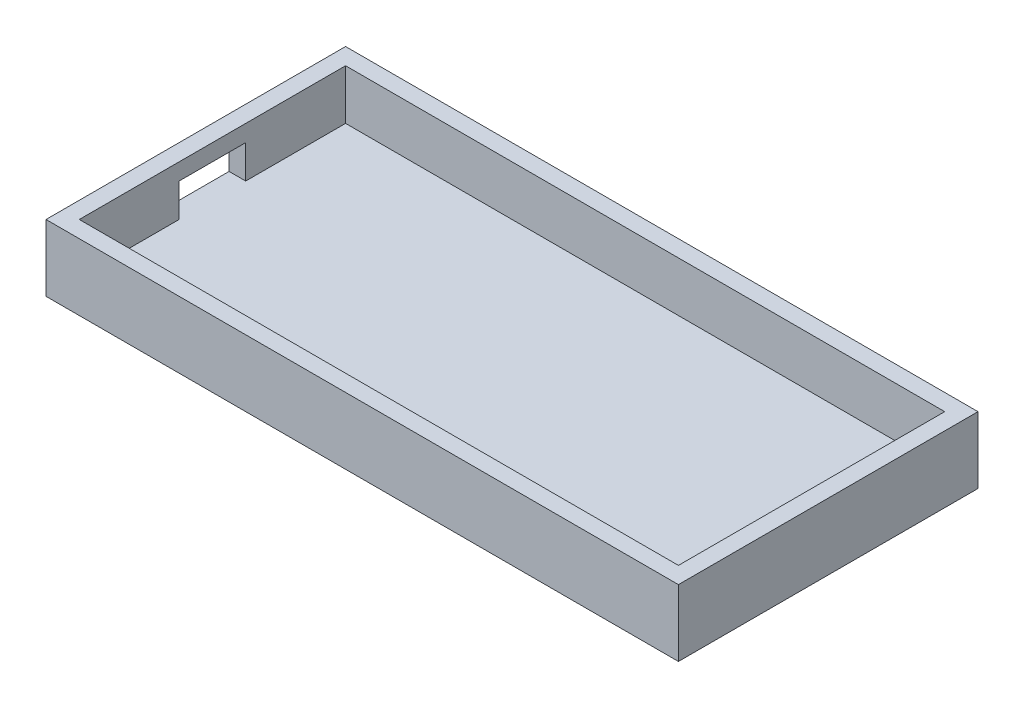
ISO-10303-21;
HEADER;
FILE_DESCRIPTION(('STEP AP214'),'2;1');
FILE_NAME('part.step','',(''),(''),'','','');
FILE_SCHEMA(('AUTOMOTIVE_DESIGN { 1 0 10303 214 1 1 1 1 }'));
ENDSEC;
DATA;
#1=APPLICATION_CONTEXT('core data for automotive mechanical design processes');
#2=APPLICATION_PROTOCOL_DEFINITION('international standard','automotive_design',2000,#1);
#3=PRODUCT_CONTEXT('',#1,'mechanical');
#4=PRODUCT('Part','Part','',(#3));
#5=PRODUCT_RELATED_PRODUCT_CATEGORY('part','',(#4));
#6=PRODUCT_DEFINITION_FORMATION('','',#4);
#7=PRODUCT_DEFINITION_CONTEXT('part definition',#1,'design');
#8=PRODUCT_DEFINITION('design','',#6,#7);
#9=PRODUCT_DEFINITION_SHAPE('','',#8);
#10=(LENGTH_UNIT() NAMED_UNIT(*) SI_UNIT(.MILLI.,.METRE.));
#11=(NAMED_UNIT(*) PLANE_ANGLE_UNIT() SI_UNIT($,.RADIAN.));
#12=(NAMED_UNIT(*) SI_UNIT($,.STERADIAN.) SOLID_ANGLE_UNIT());
#13=UNCERTAINTY_MEASURE_WITH_UNIT(LENGTH_MEASURE(1.E-05),#10,'distance_accuracy_value','');
#14=(GEOMETRIC_REPRESENTATION_CONTEXT(3) GLOBAL_UNCERTAINTY_ASSIGNED_CONTEXT((#13)) GLOBAL_UNIT_ASSIGNED_CONTEXT((#10,
#11,#12)) REPRESENTATION_CONTEXT('',''));
#15=CARTESIAN_POINT('',(0.,0.,0.));
#16=DIRECTION('',(0.,0.,1.));
#17=DIRECTION('',(1.,0.,0.));
#18=AXIS2_PLACEMENT_3D('',#15,#16,#17);
#19=CARTESIAN_POINT('',(0.,20.,-40.));
#20=DIRECTION('',(0.,0.,-1.));
#21=DIRECTION('',(-1.,0.,0.));
#22=AXIS2_PLACEMENT_3D('',#19,#20,#21);
#23=PLANE('',#22);
#24=DIRECTION('',(0.,-1.,0.));
#25=VECTOR('',#24,1.);
#26=CARTESIAN_POINT('',(-90.,20.,-40.));
#27=LINE('',#26,#25);
#28=CARTESIAN_POINT('',(-90.,20.,-40.));
#29=VERTEX_POINT('',#28);
#30=CARTESIAN_POINT('',(-90.,5.,-40.));
#31=VERTEX_POINT('',#30);
#32=EDGE_CURVE('E193',#29,#31,#27,.T.);
#33=ORIENTED_EDGE('',*,*,#32,.T.);
#34=DIRECTION('',(1.,0.,0.));
#35=VECTOR('',#34,1.);
#36=CARTESIAN_POINT('',(0.,5.,-40.));
#37=LINE('',#36,#35);
#38=CARTESIAN_POINT('',(90.,5.,-40.));
#39=VERTEX_POINT('',#38);
#40=EDGE_CURVE('E150',#31,#39,#37,.T.);
#41=ORIENTED_EDGE('',*,*,#40,.T.);
#42=DIRECTION('',(0.,-1.,0.));
#43=VECTOR('',#42,1.);
#44=CARTESIAN_POINT('',(90.,20.,-40.));
#45=LINE('',#44,#43);
#46=CARTESIAN_POINT('',(90.,20.,-40.));
#47=VERTEX_POINT('',#46);
#48=EDGE_CURVE('E11',#47,#39,#45,.T.);
#49=ORIENTED_EDGE('',*,*,#48,.F.);
#50=DIRECTION('',(1.,0.,0.));
#51=VECTOR('',#50,1.);
#52=CARTESIAN_POINT('',(0.,20.,-40.));
#53=LINE('',#52,#51);
#54=EDGE_CURVE('E172',#29,#47,#53,.T.);
#55=ORIENTED_EDGE('',*,*,#54,.F.);
#56=EDGE_LOOP('',(#33,#41,#49,#55));
#57=FACE_BOUND('',#56,.T.);
#58=ADVANCED_FACE('F41',(#57),#23,.F.);
#59=CARTESIAN_POINT('',(90.,20.,0.));
#60=DIRECTION('',(1.,0.,0.));
#61=DIRECTION('',(0.,0.,-1.));
#62=AXIS2_PLACEMENT_3D('',#59,#60,#61);
#63=PLANE('',#62);
#64=ORIENTED_EDGE('',*,*,#48,.T.);
#65=DIRECTION('',(0.,0.,1.));
#66=VECTOR('',#65,1.);
#67=CARTESIAN_POINT('',(90.,5.,0.));
#68=LINE('',#67,#66);
#69=CARTESIAN_POINT('',(90.,5.,40.));
#70=VERTEX_POINT('',#69);
#71=EDGE_CURVE('E155',#39,#70,#68,.T.);
#72=ORIENTED_EDGE('',*,*,#71,.T.);
#73=DIRECTION('',(0.,-1.,0.));
#74=VECTOR('',#73,1.);
#75=CARTESIAN_POINT('',(90.,20.,40.));
#76=LINE('',#75,#74);
#77=CARTESIAN_POINT('',(90.,20.,40.));
#78=VERTEX_POINT('',#77);
#79=EDGE_CURVE('E50',#78,#70,#76,.T.);
#80=ORIENTED_EDGE('',*,*,#79,.F.);
#81=DIRECTION('',(0.,0.,1.));
#82=VECTOR('',#81,1.);
#83=CARTESIAN_POINT('',(90.,20.,0.));
#84=LINE('',#83,#82);
#85=EDGE_CURVE('E175',#47,#78,#84,.T.);
#86=ORIENTED_EDGE('',*,*,#85,.F.);
#87=EDGE_LOOP('',(#64,#72,#80,#86));
#88=FACE_BOUND('',#87,.T.);
#89=ADVANCED_FACE('F235',(#88),#63,.F.);
#90=CARTESIAN_POINT('',(0.,20.,40.));
#91=DIRECTION('',(0.,0.,-1.));
#92=DIRECTION('',(-1.,0.,0.));
#93=AXIS2_PLACEMENT_3D('',#90,#91,#92);
#94=PLANE('',#93);
#95=DIRECTION('',(1.,0.,0.));
#96=VECTOR('',#95,1.);
#97=CARTESIAN_POINT('',(0.,5.,40.));
#98=LINE('',#97,#96);
#99=CARTESIAN_POINT('',(-90.,5.,40.));
#100=VERTEX_POINT('',#99);
#101=EDGE_CURVE('E151',#100,#70,#98,.T.);
#102=ORIENTED_EDGE('',*,*,#101,.F.);
#103=DIRECTION('',(0.,-1.,0.));
#104=VECTOR('',#103,1.);
#105=CARTESIAN_POINT('',(-90.,20.,40.));
#106=LINE('',#105,#104);
#107=CARTESIAN_POINT('',(-90.,20.,40.));
#108=VERTEX_POINT('',#107);
#109=EDGE_CURVE('E195',#108,#100,#106,.T.);
#110=ORIENTED_EDGE('',*,*,#109,.F.);
#111=DIRECTION('',(1.,0.,0.));
#112=VECTOR('',#111,1.);
#113=CARTESIAN_POINT('',(0.,20.,40.));
#114=LINE('',#113,#112);
#115=EDGE_CURVE('E177',#108,#78,#114,.T.);
#116=ORIENTED_EDGE('',*,*,#115,.T.);
#117=ORIENTED_EDGE('',*,*,#79,.T.);
#118=EDGE_LOOP('',(#102,#110,#116,#117));
#119=FACE_BOUND('',#118,.T.);
#120=ADVANCED_FACE('F239',(#119),#94,.T.);
#121=CARTESIAN_POINT('',(95.,20.,0.));
#122=DIRECTION('',(1.,0.,0.));
#123=DIRECTION('',(0.,0.,-1.));
#124=AXIS2_PLACEMENT_3D('',#121,#122,#123);
#125=PLANE('',#124);
#126=DIRECTION('',(0.,0.,1.));
#127=VECTOR('',#126,1.);
#128=CARTESIAN_POINT('',(95.,0.,0.));
#129=LINE('',#128,#127);
#130=CARTESIAN_POINT('',(95.,0.,-45.));
#131=VERTEX_POINT('',#130);
#132=CARTESIAN_POINT('',(95.,0.,45.));
#133=VERTEX_POINT('',#132);
#134=EDGE_CURVE('E160',#131,#133,#129,.T.);
#135=ORIENTED_EDGE('',*,*,#134,.F.);
#136=DIRECTION('',(0.,-1.,0.));
#137=VECTOR('',#136,1.);
#138=CARTESIAN_POINT('',(95.,20.,-45.));
#139=LINE('',#138,#137);
#140=CARTESIAN_POINT('',(95.,20.,-45.));
#141=VERTEX_POINT('',#140);
#142=EDGE_CURVE('E45',#141,#131,#139,.T.);
#143=ORIENTED_EDGE('',*,*,#142,.F.);
#144=DIRECTION('',(0.,0.,1.));
#145=VECTOR('',#144,1.);
#146=CARTESIAN_POINT('',(95.,20.,0.));
#147=LINE('',#146,#145);
#148=CARTESIAN_POINT('',(95.,20.,45.));
#149=VERTEX_POINT('',#148);
#150=EDGE_CURVE('E161',#141,#149,#147,.T.);
#151=ORIENTED_EDGE('',*,*,#150,.T.);
#152=DIRECTION('',(0.,-1.,0.));
#153=VECTOR('',#152,1.);
#154=CARTESIAN_POINT('',(95.,20.,45.));
#155=LINE('',#154,#153);
#156=EDGE_CURVE('E183',#149,#133,#155,.T.);
#157=ORIENTED_EDGE('',*,*,#156,.T.);
#158=EDGE_LOOP('',(#135,#143,#151,#157));
#159=FACE_BOUND('',#158,.T.);
#160=ADVANCED_FACE('F43',(#159),#125,.T.);
#161=CARTESIAN_POINT('',(0.,20.,-45.));
#162=DIRECTION('',(0.,0.,-1.));
#163=DIRECTION('',(-1.,0.,0.));
#164=AXIS2_PLACEMENT_3D('',#161,#162,#163);
#165=PLANE('',#164);
#166=DIRECTION('',(1.,0.,0.));
#167=VECTOR('',#166,1.);
#168=CARTESIAN_POINT('',(0.,0.,-45.));
#169=LINE('',#168,#167);
#170=CARTESIAN_POINT('',(-95.,0.,-45.));
#171=VERTEX_POINT('',#170);
#172=EDGE_CURVE('E186',#171,#131,#169,.T.);
#173=ORIENTED_EDGE('',*,*,#172,.F.);
#174=DIRECTION('',(0.,-1.,0.));
#175=VECTOR('',#174,1.);
#176=CARTESIAN_POINT('',(-95.,20.,-45.));
#177=LINE('',#176,#175);
#178=CARTESIAN_POINT('',(-95.,20.,-45.));
#179=VERTEX_POINT('',#178);
#180=EDGE_CURVE('E203',#179,#171,#177,.T.);
#181=ORIENTED_EDGE('',*,*,#180,.F.);
#182=DIRECTION('',(1.,0.,0.));
#183=VECTOR('',#182,1.);
#184=CARTESIAN_POINT('',(0.,20.,-45.));
#185=LINE('',#184,#183);
#186=EDGE_CURVE('E164',#179,#141,#185,.T.);
#187=ORIENTED_EDGE('',*,*,#186,.T.);
#188=ORIENTED_EDGE('',*,*,#142,.T.);
#189=EDGE_LOOP('',(#173,#181,#187,#188));
#190=FACE_BOUND('',#189,.T.);
#191=ADVANCED_FACE('F210',(#190),#165,.T.);
#192=CARTESIAN_POINT('',(-95.,20.,0.));
#193=DIRECTION('',(1.,0.,0.));
#194=DIRECTION('',(0.,0.,-1.));
#195=AXIS2_PLACEMENT_3D('',#192,#193,#194);
#196=PLANE('',#195);
#197=DIRECTION('',(0.,0.,1.));
#198=VECTOR('',#197,1.);
#199=CARTESIAN_POINT('',(-95.,5.00000000000001,0.));
#200=LINE('',#199,#198);
#201=CARTESIAN_POINT('',(-95.,5.00000000000001,-9.99999999999997));
#202=VERTEX_POINT('',#201);
#203=CARTESIAN_POINT('',(-95.,5.00000000000001,10.));
#204=VERTEX_POINT('',#203);
#205=EDGE_CURVE('E246',#202,#204,#200,.T.);
#206=ORIENTED_EDGE('',*,*,#205,.F.);
#207=DIRECTION('',(0.,-1.,0.));
#208=VECTOR('',#207,1.);
#209=CARTESIAN_POINT('',(-95.,0.,-9.99999999999997));
#210=LINE('',#209,#208);
#211=CARTESIAN_POINT('',(-95.,15.,-9.99999999999997));
#212=VERTEX_POINT('',#211);
#213=EDGE_CURVE('E58',#212,#202,#210,.T.);
#214=ORIENTED_EDGE('',*,*,#213,.F.);
#215=DIRECTION('',(0.,0.,1.));
#216=VECTOR('',#215,1.);
#217=CARTESIAN_POINT('',(-95.,15.,0.));
#218=LINE('',#217,#216);
#219=CARTESIAN_POINT('',(-95.,15.,10.));
#220=VERTEX_POINT('',#219);
#221=EDGE_CURVE('E145',#212,#220,#218,.T.);
#222=ORIENTED_EDGE('',*,*,#221,.T.);
#223=DIRECTION('',(0.,-1.,0.));
#224=VECTOR('',#223,1.);
#225=CARTESIAN_POINT('',(-95.,0.,10.));
#226=LINE('',#225,#224);
#227=EDGE_CURVE('E248',#220,#204,#226,.T.);
#228=ORIENTED_EDGE('',*,*,#227,.T.);
#229=EDGE_LOOP('',(#206,#214,#222,#228));
#230=FACE_BOUND('',#229,.T.);
#231=DIRECTION('',(0.,0.,1.));
#232=VECTOR('',#231,1.);
#233=CARTESIAN_POINT('',(-95.,0.,0.));
#234=LINE('',#233,#232);
#235=CARTESIAN_POINT('',(-95.,0.,45.));
#236=VERTEX_POINT('',#235);
#237=EDGE_CURVE('E189',#171,#236,#234,.T.);
#238=ORIENTED_EDGE('',*,*,#237,.T.);
#239=DIRECTION('',(0.,-1.,0.));
#240=VECTOR('',#239,1.);
#241=CARTESIAN_POINT('',(-95.,20.,45.));
#242=LINE('',#241,#240);
#243=CARTESIAN_POINT('',(-95.,20.,45.));
#244=VERTEX_POINT('',#243);
#245=EDGE_CURVE('E201',#244,#236,#242,.T.);
#246=ORIENTED_EDGE('',*,*,#245,.F.);
#247=DIRECTION('',(0.,0.,1.));
#248=VECTOR('',#247,1.);
#249=CARTESIAN_POINT('',(-95.,20.,0.));
#250=LINE('',#249,#248);
#251=EDGE_CURVE('E168',#179,#244,#250,.T.);
#252=ORIENTED_EDGE('',*,*,#251,.F.);
#253=ORIENTED_EDGE('',*,*,#180,.T.);
#254=EDGE_LOOP('',(#238,#246,#252,#253));
#255=FACE_BOUND('',#254,.T.);
#256=ADVANCED_FACE('F219',(#230,#255),#196,.F.);
#257=CARTESIAN_POINT('',(0.,20.,45.));
#258=DIRECTION('',(0.,0.,-1.));
#259=DIRECTION('',(-1.,0.,0.));
#260=AXIS2_PLACEMENT_3D('',#257,#258,#259);
#261=PLANE('',#260);
#262=DIRECTION('',(1.,0.,0.));
#263=VECTOR('',#262,1.);
#264=CARTESIAN_POINT('',(0.,0.,45.));
#265=LINE('',#264,#263);
#266=EDGE_CURVE('E165',#236,#133,#265,.T.);
#267=ORIENTED_EDGE('',*,*,#266,.T.);
#268=ORIENTED_EDGE('',*,*,#156,.F.);
#269=DIRECTION('',(1.,0.,0.));
#270=VECTOR('',#269,1.);
#271=CARTESIAN_POINT('',(0.,20.,45.));
#272=LINE('',#271,#270);
#273=EDGE_CURVE('E170',#244,#149,#272,.T.);
#274=ORIENTED_EDGE('',*,*,#273,.F.);
#275=ORIENTED_EDGE('',*,*,#245,.T.);
#276=EDGE_LOOP('',(#267,#268,#274,#275));
#277=FACE_BOUND('',#276,.T.);
#278=ADVANCED_FACE('F222',(#277),#261,.F.);
#279=CARTESIAN_POINT('',(-90.,20.,0.));
#280=DIRECTION('',(1.,0.,0.));
#281=DIRECTION('',(0.,0.,-1.));
#282=AXIS2_PLACEMENT_3D('',#279,#280,#281);
#283=PLANE('',#282);
#284=DIRECTION('',(0.,-1.,0.));
#285=VECTOR('',#284,1.);
#286=CARTESIAN_POINT('',(-90.,0.,-9.99999999999997));
#287=LINE('',#286,#285);
#288=CARTESIAN_POINT('',(-90.,15.,-9.99999999999997));
#289=VERTEX_POINT('',#288);
#290=CARTESIAN_POINT('',(-90.,5.00000000000001,-9.99999999999997));
#291=VERTEX_POINT('',#290);
#292=EDGE_CURVE('E133',#289,#291,#287,.T.);
#293=ORIENTED_EDGE('',*,*,#292,.T.);
#294=DIRECTION('',(0.,0.,1.));
#295=VECTOR('',#294,1.);
#296=CARTESIAN_POINT('',(-90.,5.,0.));
#297=LINE('',#296,#295);
#298=EDGE_CURVE('E141',#31,#291,#297,.T.);
#299=ORIENTED_EDGE('',*,*,#298,.F.);
#300=ORIENTED_EDGE('',*,*,#32,.F.);
#301=DIRECTION('',(0.,0.,1.));
#302=VECTOR('',#301,1.);
#303=CARTESIAN_POINT('',(-90.,20.,0.));
#304=LINE('',#303,#302);
#305=EDGE_CURVE('E180',#29,#108,#304,.T.);
#306=ORIENTED_EDGE('',*,*,#305,.T.);
#307=ORIENTED_EDGE('',*,*,#109,.T.);
#308=CARTESIAN_POINT('',(-90.,5.,10.));
#309=VERTEX_POINT('',#308);
#310=EDGE_CURVE('E152',#309,#100,#297,.T.);
#311=ORIENTED_EDGE('',*,*,#310,.F.);
#312=DIRECTION('',(0.,-1.,0.));
#313=VECTOR('',#312,1.);
#314=CARTESIAN_POINT('',(-90.,0.,10.));
#315=LINE('',#314,#313);
#316=CARTESIAN_POINT('',(-90.,15.,10.));
#317=VERTEX_POINT('',#316);
#318=EDGE_CURVE('E144',#317,#309,#315,.T.);
#319=ORIENTED_EDGE('',*,*,#318,.F.);
#320=DIRECTION('',(0.,0.,1.));
#321=VECTOR('',#320,1.);
#322=CARTESIAN_POINT('',(-90.,15.,0.));
#323=LINE('',#322,#321);
#324=EDGE_CURVE('E137',#289,#317,#323,.T.);
#325=ORIENTED_EDGE('',*,*,#324,.F.);
#326=EDGE_LOOP('',(#293,#299,#300,#306,#307,#311,#319,#325));
#327=FACE_BOUND('',#326,.T.);
#328=ADVANCED_FACE('F140',(#327),#283,.T.);
#329=CARTESIAN_POINT('',(0.,20.,0.));
#330=DIRECTION('',(0.,1.,0.));
#331=DIRECTION('',(0.,0.,1.));
#332=AXIS2_PLACEMENT_3D('',#329,#330,#331);
#333=PLANE('',#332);
#334=ORIENTED_EDGE('',*,*,#150,.F.);
#335=ORIENTED_EDGE('',*,*,#186,.F.);
#336=ORIENTED_EDGE('',*,*,#251,.T.);
#337=ORIENTED_EDGE('',*,*,#273,.T.);
#338=EDGE_LOOP('',(#334,#335,#336,#337));
#339=FACE_BOUND('',#338,.T.);
#340=ORIENTED_EDGE('',*,*,#54,.T.);
#341=ORIENTED_EDGE('',*,*,#85,.T.);
#342=ORIENTED_EDGE('',*,*,#115,.F.);
#343=ORIENTED_EDGE('',*,*,#305,.F.);
#344=EDGE_LOOP('',(#340,#341,#342,#343));
#345=FACE_BOUND('',#344,.T.);
#346=ADVANCED_FACE('F224',(#339,#345),#333,.T.);
#347=CARTESIAN_POINT('',(0.,0.,0.));
#348=DIRECTION('',(0.,1.,0.));
#349=DIRECTION('',(0.,0.,1.));
#350=AXIS2_PLACEMENT_3D('',#347,#348,#349);
#351=PLANE('',#350);
#352=ORIENTED_EDGE('',*,*,#134,.T.);
#353=ORIENTED_EDGE('',*,*,#266,.F.);
#354=ORIENTED_EDGE('',*,*,#237,.F.);
#355=ORIENTED_EDGE('',*,*,#172,.T.);
#356=EDGE_LOOP('',(#352,#353,#354,#355));
#357=FACE_BOUND('',#356,.T.);
#358=ADVANCED_FACE('F217',(#357),#351,.F.);
#359=CARTESIAN_POINT('',(0.,5.,0.));
#360=DIRECTION('',(0.,1.,0.));
#361=DIRECTION('',(0.,0.,1.));
#362=AXIS2_PLACEMENT_3D('',#359,#360,#361);
#363=PLANE('',#362);
#364=ORIENTED_EDGE('',*,*,#40,.F.);
#365=ORIENTED_EDGE('',*,*,#298,.T.);
#366=DIRECTION('',(-1.,0.,0.));
#367=VECTOR('',#366,1.);
#368=CARTESIAN_POINT('',(-90.,5.00000000000001,-9.99999999999997));
#369=LINE('',#368,#367);
#370=EDGE_CURVE('E130',#291,#202,#369,.T.);
#371=ORIENTED_EDGE('',*,*,#370,.T.);
#372=ORIENTED_EDGE('',*,*,#205,.T.);
#373=DIRECTION('',(-1.,0.,0.));
#374=VECTOR('',#373,1.);
#375=CARTESIAN_POINT('',(-90.,5.00000000000001,10.));
#376=LINE('',#375,#374);
#377=EDGE_CURVE('E66',#309,#204,#376,.T.);
#378=ORIENTED_EDGE('',*,*,#377,.F.);
#379=ORIENTED_EDGE('',*,*,#310,.T.);
#380=ORIENTED_EDGE('',*,*,#101,.T.);
#381=ORIENTED_EDGE('',*,*,#71,.F.);
#382=EDGE_LOOP('',(#364,#365,#371,#372,#378,#379,#380,#381));
#383=FACE_BOUND('',#382,.T.);
#384=ADVANCED_FACE('F148',(#383),#363,.T.);
#385=CARTESIAN_POINT('',(-90.,0.,-9.99999999999997));
#386=DIRECTION('',(0.,0.,-1.));
#387=DIRECTION('',(-1.,0.,0.));
#388=AXIS2_PLACEMENT_3D('',#385,#386,#387);
#389=PLANE('',#388);
#390=ORIENTED_EDGE('',*,*,#213,.T.);
#391=ORIENTED_EDGE('',*,*,#370,.F.);
#392=ORIENTED_EDGE('',*,*,#292,.F.);
#393=DIRECTION('',(-1.,0.,0.));
#394=VECTOR('',#393,1.);
#395=CARTESIAN_POINT('',(-90.,15.,-9.99999999999997));
#396=LINE('',#395,#394);
#397=EDGE_CURVE('E253',#289,#212,#396,.T.);
#398=ORIENTED_EDGE('',*,*,#397,.T.);
#399=EDGE_LOOP('',(#390,#391,#392,#398));
#400=FACE_BOUND('',#399,.T.);
#401=ADVANCED_FACE('F132',(#400),#389,.F.);
#402=CARTESIAN_POINT('',(-90.,15.,0.));
#403=DIRECTION('',(0.,-1.,0.));
#404=DIRECTION('',(0.,0.,-1.));
#405=AXIS2_PLACEMENT_3D('',#402,#403,#404);
#406=PLANE('',#405);
#407=ORIENTED_EDGE('',*,*,#221,.F.);
#408=ORIENTED_EDGE('',*,*,#397,.F.);
#409=ORIENTED_EDGE('',*,*,#324,.T.);
#410=DIRECTION('',(-1.,0.,0.));
#411=VECTOR('',#410,1.);
#412=CARTESIAN_POINT('',(-90.,15.,10.));
#413=LINE('',#412,#411);
#414=EDGE_CURVE('E255',#317,#220,#413,.T.);
#415=ORIENTED_EDGE('',*,*,#414,.T.);
#416=EDGE_LOOP('',(#407,#408,#409,#415));
#417=FACE_BOUND('',#416,.T.);
#418=ADVANCED_FACE('F262',(#417),#406,.T.);
#419=CARTESIAN_POINT('',(-90.,0.,10.));
#420=DIRECTION('',(0.,0.,-1.));
#421=DIRECTION('',(-1.,0.,0.));
#422=AXIS2_PLACEMENT_3D('',#419,#420,#421);
#423=PLANE('',#422);
#424=ORIENTED_EDGE('',*,*,#227,.F.);
#425=ORIENTED_EDGE('',*,*,#414,.F.);
#426=ORIENTED_EDGE('',*,*,#318,.T.);
#427=ORIENTED_EDGE('',*,*,#377,.T.);
#428=EDGE_LOOP('',(#424,#425,#426,#427));
#429=FACE_BOUND('',#428,.T.);
#430=ADVANCED_FACE('F258',(#429),#423,.T.);
#431=CLOSED_SHELL('',(#58,#89,#120,#160,#191,#256,#278,#328,#346,#358,#384,#401,#418,#430));
#432=MANIFOLD_SOLID_BREP('B2',#431);
#433=ADVANCED_BREP_SHAPE_REPRESENTATION('',(#18,#432),#14);
#434=SHAPE_DEFINITION_REPRESENTATION(#9,#433);
ENDSEC;
END-ISO-10303-21;
